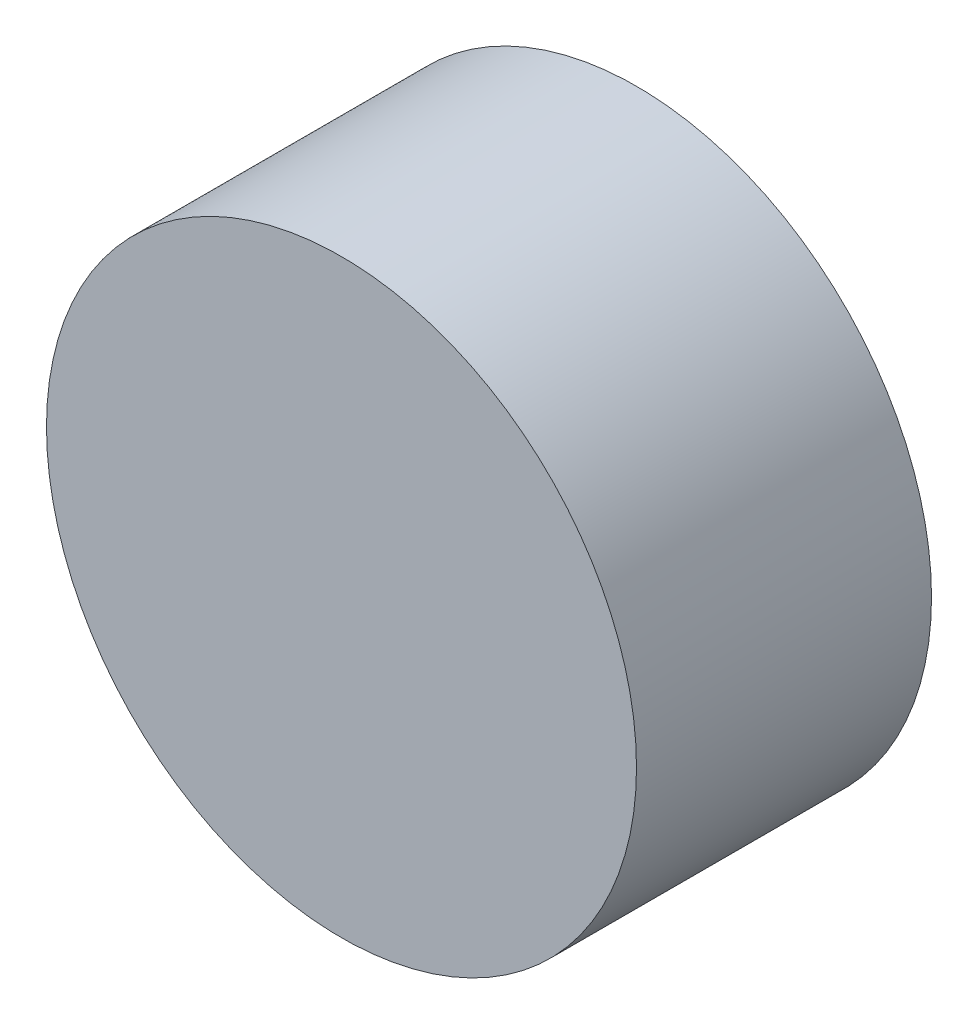
ISO-10303-21;
HEADER;
FILE_DESCRIPTION(('STEP AP214'),'2;1');
FILE_NAME('part.step','',(''),(''),'','','');
FILE_SCHEMA(('AUTOMOTIVE_DESIGN { 1 0 10303 214 1 1 1 1 }'));
ENDSEC;
DATA;
#1=APPLICATION_CONTEXT('core data for automotive mechanical design processes');
#2=APPLICATION_PROTOCOL_DEFINITION('international standard','automotive_design',2000,#1);
#3=PRODUCT_CONTEXT('',#1,'mechanical');
#4=PRODUCT('Part','Part','',(#3));
#5=PRODUCT_RELATED_PRODUCT_CATEGORY('part','',(#4));
#6=PRODUCT_DEFINITION_FORMATION('','',#4);
#7=PRODUCT_DEFINITION_CONTEXT('part definition',#1,'design');
#8=PRODUCT_DEFINITION('design','',#6,#7);
#9=PRODUCT_DEFINITION_SHAPE('','',#8);
#10=(LENGTH_UNIT() NAMED_UNIT(*) SI_UNIT(.MILLI.,.METRE.));
#11=(NAMED_UNIT(*) PLANE_ANGLE_UNIT() SI_UNIT($,.RADIAN.));
#12=(NAMED_UNIT(*) SI_UNIT($,.STERADIAN.) SOLID_ANGLE_UNIT());
#13=UNCERTAINTY_MEASURE_WITH_UNIT(LENGTH_MEASURE(1.E-05),#10,'distance_accuracy_value','');
#14=(GEOMETRIC_REPRESENTATION_CONTEXT(3) GLOBAL_UNCERTAINTY_ASSIGNED_CONTEXT((#13)) GLOBAL_UNIT_ASSIGNED_CONTEXT((#10,
#11,#12)) REPRESENTATION_CONTEXT('',''));
#15=CARTESIAN_POINT('',(0.,0.,0.));
#16=DIRECTION('',(0.,0.,1.));
#17=DIRECTION('',(1.,0.,0.));
#18=AXIS2_PLACEMENT_3D('',#15,#16,#17);
#19=CARTESIAN_POINT('',(0.,0.,100.));
#20=DIRECTION('',(0.,0.,-1.));
#21=DIRECTION('',(-1.,0.,0.));
#22=AXIS2_PLACEMENT_3D('',#19,#20,#21);
#23=CYLINDRICAL_SURFACE('',#22,100.);
#24=CARTESIAN_POINT('',(0.,0.,100.));
#25=DIRECTION('',(0.,0.,1.));
#26=DIRECTION('',(1.,0.,0.));
#27=AXIS2_PLACEMENT_3D('',#24,#25,#26);
#28=CIRCLE('',#27,100.);
#29=CARTESIAN_POINT('',(100.,0.,100.));
#30=VERTEX_POINT('',#29);
#31=EDGE_CURVE('E106',#30,#30,#28,.T.);
#32=ORIENTED_EDGE('',*,*,#31,.F.);
#33=EDGE_LOOP('',(#32));
#34=FACE_BOUND('',#33,.T.);
#35=CARTESIAN_POINT('',(0.,0.,0.));
#36=DIRECTION('',(0.,0.,1.));
#37=DIRECTION('',(1.,0.,0.));
#38=AXIS2_PLACEMENT_3D('',#35,#36,#37);
#39=CIRCLE('',#38,100.);
#40=CARTESIAN_POINT('',(100.,0.,0.));
#41=VERTEX_POINT('',#40);
#42=EDGE_CURVE('E102',#41,#41,#39,.T.);
#43=ORIENTED_EDGE('',*,*,#42,.T.);
#44=EDGE_LOOP('',(#43));
#45=FACE_BOUND('',#44,.T.);
#46=ADVANCED_FACE('F34',(#34,#45),#23,.T.);
#47=CARTESIAN_POINT('',(0.,0.,100.));
#48=DIRECTION('',(0.,0.,1.));
#49=DIRECTION('',(1.,0.,0.));
#50=AXIS2_PLACEMENT_3D('',#47,#48,#49);
#51=PLANE('',#50);
#52=ORIENTED_EDGE('',*,*,#31,.T.);
#53=EDGE_LOOP('',(#52));
#54=FACE_BOUND('',#53,.T.);
#55=ADVANCED_FACE('F134',(#54),#51,.T.);
#56=CARTESIAN_POINT('',(0.,0.,0.));
#57=DIRECTION('',(0.,0.,1.));
#58=DIRECTION('',(1.,0.,0.));
#59=AXIS2_PLACEMENT_3D('',#56,#57,#58);
#60=PLANE('',#59);
#61=DIRECTION('',(-1.,0.,0.));
#62=VECTOR('',#61,1.);
#63=CARTESIAN_POINT('',(0.,5.,0.));
#64=LINE('',#63,#62);
#65=CARTESIAN_POINT('',(12.5,5.,0.));
#66=VERTEX_POINT('',#65);
#67=CARTESIAN_POINT('',(-12.5,5.,0.));
#68=VERTEX_POINT('',#67);
#69=EDGE_CURVE('E109',#66,#68,#64,.T.);
#70=ORIENTED_EDGE('',*,*,#69,.T.);
#71=DIRECTION('',(0.,-1.,0.));
#72=VECTOR('',#71,1.);
#73=CARTESIAN_POINT('',(-12.5,0.,0.));
#74=LINE('',#73,#72);
#75=CARTESIAN_POINT('',(-12.5,-5.,0.));
#76=VERTEX_POINT('',#75);
#77=EDGE_CURVE('E11',#68,#76,#74,.T.);
#78=ORIENTED_EDGE('',*,*,#77,.T.);
#79=DIRECTION('',(1.,0.,0.));
#80=VECTOR('',#79,1.);
#81=CARTESIAN_POINT('',(0.,-5.,0.));
#82=LINE('',#81,#80);
#83=CARTESIAN_POINT('',(12.5,-5.,0.));
#84=VERTEX_POINT('',#83);
#85=EDGE_CURVE('E42',#76,#84,#82,.T.);
#86=ORIENTED_EDGE('',*,*,#85,.T.);
#87=DIRECTION('',(0.,1.,0.));
#88=VECTOR('',#87,1.);
#89=CARTESIAN_POINT('',(12.5,0.,0.));
#90=LINE('',#89,#88);
#91=EDGE_CURVE('E113',#84,#66,#90,.T.);
#92=ORIENTED_EDGE('',*,*,#91,.T.);
#93=EDGE_LOOP('',(#70,#78,#86,#92));
#94=FACE_BOUND('',#93,.T.);
#95=ORIENTED_EDGE('',*,*,#42,.F.);
#96=EDGE_LOOP('',(#95));
#97=FACE_BOUND('',#96,.T.);
#98=ADVANCED_FACE('F117',(#94,#97),#60,.F.);
#99=CARTESIAN_POINT('',(-12.5,-5.,20.));
#100=DIRECTION('',(-1.,0.,0.));
#101=DIRECTION('',(0.,0.,1.));
#102=AXIS2_PLACEMENT_3D('',#99,#100,#101);
#103=PLANE('',#102);
#104=ORIENTED_EDGE('',*,*,#77,.F.);
#105=DIRECTION('',(0.,0.,-1.));
#106=VECTOR('',#105,1.);
#107=CARTESIAN_POINT('',(-12.5,5.,20.));
#108=LINE('',#107,#106);
#109=CARTESIAN_POINT('',(-12.5,5.,-20.));
#110=VERTEX_POINT('',#109);
#111=EDGE_CURVE('E49',#68,#110,#108,.T.);
#112=ORIENTED_EDGE('',*,*,#111,.T.);
#113=DIRECTION('',(0.,1.,0.));
#114=VECTOR('',#113,1.);
#115=CARTESIAN_POINT('',(-12.5,-5.,-20.));
#116=LINE('',#115,#114);
#117=CARTESIAN_POINT('',(-12.5,-5.,-20.));
#118=VERTEX_POINT('',#117);
#119=EDGE_CURVE('E76',#118,#110,#116,.T.);
#120=ORIENTED_EDGE('',*,*,#119,.F.);
#121=DIRECTION('',(0.,0.,-1.));
#122=VECTOR('',#121,1.);
#123=CARTESIAN_POINT('',(-12.5,-5.,20.));
#124=LINE('',#123,#122);
#125=EDGE_CURVE('E100',#76,#118,#124,.T.);
#126=ORIENTED_EDGE('',*,*,#125,.F.);
#127=EDGE_LOOP('',(#104,#112,#120,#126));
#128=FACE_BOUND('',#127,.T.);
#129=ADVANCED_FACE('F74',(#128),#103,.T.);
#130=CARTESIAN_POINT('',(12.5,-5.,20.));
#131=DIRECTION('',(0.,-1.,0.));
#132=DIRECTION('',(0.,0.,-1.));
#133=AXIS2_PLACEMENT_3D('',#130,#131,#132);
#134=PLANE('',#133);
#135=CARTESIAN_POINT('',(0.,-5.,-10.));
#136=DIRECTION('',(0.,-1.,0.));
#137=DIRECTION('',(0.,0.,-1.));
#138=AXIS2_PLACEMENT_3D('',#135,#136,#137);
#139=CIRCLE('',#138,5.);
#140=CARTESIAN_POINT('',(0.,-5.,-15.));
#141=VERTEX_POINT('',#140);
#142=EDGE_CURVE('E95',#141,#141,#139,.T.);
#143=ORIENTED_EDGE('',*,*,#142,.F.);
#144=EDGE_LOOP('',(#143));
#145=FACE_BOUND('',#144,.T.);
#146=ORIENTED_EDGE('',*,*,#85,.F.);
#147=ORIENTED_EDGE('',*,*,#125,.T.);
#148=DIRECTION('',(-1.,0.,0.));
#149=VECTOR('',#148,1.);
#150=CARTESIAN_POINT('',(12.5,-5.,-20.));
#151=LINE('',#150,#149);
#152=CARTESIAN_POINT('',(12.5,-5.,-20.));
#153=VERTEX_POINT('',#152);
#154=EDGE_CURVE('E79',#153,#118,#151,.T.);
#155=ORIENTED_EDGE('',*,*,#154,.F.);
#156=DIRECTION('',(0.,0.,-1.));
#157=VECTOR('',#156,1.);
#158=CARTESIAN_POINT('',(12.5,-5.,20.));
#159=LINE('',#158,#157);
#160=EDGE_CURVE('E103',#84,#153,#159,.T.);
#161=ORIENTED_EDGE('',*,*,#160,.F.);
#162=EDGE_LOOP('',(#146,#147,#155,#161));
#163=FACE_BOUND('',#162,.T.);
#164=ADVANCED_FACE('F121',(#145,#163),#134,.T.);
#165=CARTESIAN_POINT('',(12.5,-5.,20.));
#166=DIRECTION('',(1.,0.,0.));
#167=DIRECTION('',(0.,0.,-1.));
#168=AXIS2_PLACEMENT_3D('',#165,#166,#167);
#169=PLANE('',#168);
#170=ORIENTED_EDGE('',*,*,#91,.F.);
#171=ORIENTED_EDGE('',*,*,#160,.T.);
#172=DIRECTION('',(0.,-1.,0.));
#173=VECTOR('',#172,1.);
#174=CARTESIAN_POINT('',(12.5,-5.,-20.));
#175=LINE('',#174,#173);
#176=CARTESIAN_POINT('',(12.5,5.,-20.));
#177=VERTEX_POINT('',#176);
#178=EDGE_CURVE('E88',#177,#153,#175,.T.);
#179=ORIENTED_EDGE('',*,*,#178,.F.);
#180=DIRECTION('',(0.,0.,-1.));
#181=VECTOR('',#180,1.);
#182=CARTESIAN_POINT('',(12.5,5.,20.));
#183=LINE('',#182,#181);
#184=EDGE_CURVE('E78',#66,#177,#183,.T.);
#185=ORIENTED_EDGE('',*,*,#184,.F.);
#186=EDGE_LOOP('',(#170,#171,#179,#185));
#187=FACE_BOUND('',#186,.T.);
#188=ADVANCED_FACE('F120',(#187),#169,.T.);
#189=CARTESIAN_POINT('',(12.5,5.,20.));
#190=DIRECTION('',(0.,1.,0.));
#191=DIRECTION('',(0.,0.,1.));
#192=AXIS2_PLACEMENT_3D('',#189,#190,#191);
#193=PLANE('',#192);
#194=CARTESIAN_POINT('',(0.,5.,-10.));
#195=DIRECTION('',(0.,1.,0.));
#196=DIRECTION('',(0.,0.,1.));
#197=AXIS2_PLACEMENT_3D('',#194,#195,#196);
#198=CIRCLE('',#197,5.);
#199=CARTESIAN_POINT('',(0.,5.,-5.));
#200=VERTEX_POINT('',#199);
#201=EDGE_CURVE('E37',#200,#200,#198,.T.);
#202=ORIENTED_EDGE('',*,*,#201,.F.);
#203=EDGE_LOOP('',(#202));
#204=FACE_BOUND('',#203,.T.);
#205=ORIENTED_EDGE('',*,*,#69,.F.);
#206=ORIENTED_EDGE('',*,*,#184,.T.);
#207=DIRECTION('',(1.,0.,0.));
#208=VECTOR('',#207,1.);
#209=CARTESIAN_POINT('',(12.5,5.,-20.));
#210=LINE('',#209,#208);
#211=EDGE_CURVE('E82',#110,#177,#210,.T.);
#212=ORIENTED_EDGE('',*,*,#211,.F.);
#213=ORIENTED_EDGE('',*,*,#111,.F.);
#214=EDGE_LOOP('',(#205,#206,#212,#213));
#215=FACE_BOUND('',#214,.T.);
#216=ADVANCED_FACE('F83',(#204,#215),#193,.T.);
#217=CARTESIAN_POINT('',(0.,0.,-20.));
#218=DIRECTION('',(0.,0.,1.));
#219=DIRECTION('',(1.,0.,0.));
#220=AXIS2_PLACEMENT_3D('',#217,#218,#219);
#221=PLANE('',#220);
#222=ORIENTED_EDGE('',*,*,#119,.T.);
#223=ORIENTED_EDGE('',*,*,#211,.T.);
#224=ORIENTED_EDGE('',*,*,#178,.T.);
#225=ORIENTED_EDGE('',*,*,#154,.T.);
#226=EDGE_LOOP('',(#222,#223,#224,#225));
#227=FACE_BOUND('',#226,.T.);
#228=ADVANCED_FACE('F91',(#227),#221,.F.);
#229=CARTESIAN_POINT('',(0.,15.,-10.));
#230=DIRECTION('',(0.,-1.,0.));
#231=DIRECTION('',(0.,0.,-1.));
#232=AXIS2_PLACEMENT_3D('',#229,#230,#231);
#233=CYLINDRICAL_SURFACE('',#232,5.);
#234=ORIENTED_EDGE('',*,*,#201,.T.);
#235=EDGE_LOOP('',(#234));
#236=FACE_BOUND('',#235,.T.);
#237=ORIENTED_EDGE('',*,*,#142,.T.);
#238=EDGE_LOOP('',(#237));
#239=FACE_BOUND('',#238,.T.);
#240=ADVANCED_FACE('F153',(#236,#239),#233,.F.);
#241=CLOSED_SHELL('',(#46,#55,#98,#129,#164,#188,#216,#228,#240));
#242=MANIFOLD_SOLID_BREP('B2',#241);
#243=ADVANCED_BREP_SHAPE_REPRESENTATION('',(#18,#242),#14);
#244=SHAPE_DEFINITION_REPRESENTATION(#9,#243);
ENDSEC;
END-ISO-10303-21;
